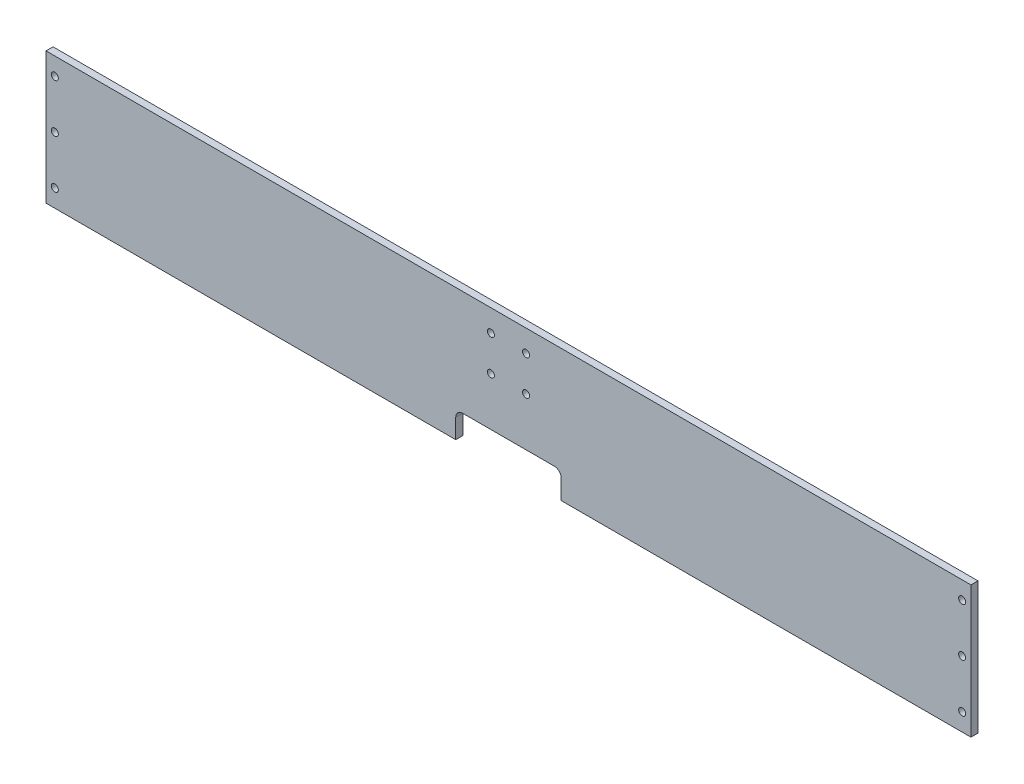
ISO-10303-21;
HEADER;
FILE_DESCRIPTION(('STEP AP214'),'2;1');
FILE_NAME('part.step','',(''),(''),'','','');
FILE_SCHEMA(('AUTOMOTIVE_DESIGN { 1 0 10303 214 1 1 1 1 }'));
ENDSEC;
DATA;
#1=APPLICATION_CONTEXT('core data for automotive mechanical design processes');
#2=APPLICATION_PROTOCOL_DEFINITION('international standard','automotive_design',2000,#1);
#3=PRODUCT_CONTEXT('',#1,'mechanical');
#4=PRODUCT('Part','Part','',(#3));
#5=PRODUCT_RELATED_PRODUCT_CATEGORY('part','',(#4));
#6=PRODUCT_DEFINITION_FORMATION('','',#4);
#7=PRODUCT_DEFINITION_CONTEXT('part definition',#1,'design');
#8=PRODUCT_DEFINITION('design','',#6,#7);
#9=PRODUCT_DEFINITION_SHAPE('','',#8);
#10=(LENGTH_UNIT() NAMED_UNIT(*) SI_UNIT(.MILLI.,.METRE.));
#11=(NAMED_UNIT(*) PLANE_ANGLE_UNIT() SI_UNIT($,.RADIAN.));
#12=(NAMED_UNIT(*) SI_UNIT($,.STERADIAN.) SOLID_ANGLE_UNIT());
#13=UNCERTAINTY_MEASURE_WITH_UNIT(LENGTH_MEASURE(1.E-05),#10,'distance_accuracy_value','');
#14=(GEOMETRIC_REPRESENTATION_CONTEXT(3) GLOBAL_UNCERTAINTY_ASSIGNED_CONTEXT((#13)) GLOBAL_UNIT_ASSIGNED_CONTEXT((#10,
#11,#12)) REPRESENTATION_CONTEXT('',''));
#15=CARTESIAN_POINT('',(0.,0.,0.));
#16=DIRECTION('',(0.,0.,1.));
#17=DIRECTION('',(1.,0.,0.));
#18=AXIS2_PLACEMENT_3D('',#15,#16,#17);
#19=CARTESIAN_POINT('',(0.,0.,-4.));
#20=DIRECTION('',(0.,-1.,0.));
#21=DIRECTION('',(0.,0.,-1.));
#22=AXIS2_PLACEMENT_3D('',#19,#20,#21);
#23=PLANE('',#22);
#24=DIRECTION('',(0.,0.,-1.));
#25=VECTOR('',#24,1.);
#26=CARTESIAN_POINT('',(233.,0.,-4.));
#27=LINE('',#26,#25);
#28=CARTESIAN_POINT('',(233.,0.,0.));
#29=VERTEX_POINT('',#28);
#30=CARTESIAN_POINT('',(233.,0.,-4.));
#31=VERTEX_POINT('',#30);
#32=EDGE_CURVE('E162',#29,#31,#27,.T.);
#33=ORIENTED_EDGE('',*,*,#32,.F.);
#34=DIRECTION('',(1.,0.,0.));
#35=VECTOR('',#34,1.);
#36=CARTESIAN_POINT('',(0.,0.,0.));
#37=LINE('',#36,#35);
#38=CARTESIAN_POINT('',(0.,0.,0.));
#39=VERTEX_POINT('',#38);
#40=EDGE_CURVE('E238',#39,#29,#37,.T.);
#41=ORIENTED_EDGE('',*,*,#40,.F.);
#42=DIRECTION('',(0.,0.,1.));
#43=VECTOR('',#42,1.);
#44=CARTESIAN_POINT('',(0.,0.,-4.));
#45=LINE('',#44,#43);
#46=CARTESIAN_POINT('',(0.,0.,-4.));
#47=VERTEX_POINT('',#46);
#48=EDGE_CURVE('E80',#47,#39,#45,.T.);
#49=ORIENTED_EDGE('',*,*,#48,.F.);
#50=DIRECTION('',(1.,0.,0.));
#51=VECTOR('',#50,1.);
#52=CARTESIAN_POINT('',(0.,0.,-4.));
#53=LINE('',#52,#51);
#54=EDGE_CURVE('E228',#47,#31,#53,.T.);
#55=ORIENTED_EDGE('',*,*,#54,.T.);
#56=EDGE_LOOP('',(#33,#41,#49,#55));
#57=FACE_BOUND('',#56,.T.);
#58=ADVANCED_FACE('F32',(#57),#23,.T.);
#59=CARTESIAN_POINT('',(0.,0.,-4.));
#60=DIRECTION('',(-1.,0.,0.));
#61=DIRECTION('',(0.,0.,1.));
#62=AXIS2_PLACEMENT_3D('',#59,#60,#61);
#63=PLANE('',#62);
#64=DIRECTION('',(0.,-1.,0.));
#65=VECTOR('',#64,1.);
#66=CARTESIAN_POINT('',(0.,0.,0.));
#67=LINE('',#66,#65);
#68=CARTESIAN_POINT('',(0.,75.,0.));
#69=VERTEX_POINT('',#68);
#70=EDGE_CURVE('E222',#69,#39,#67,.T.);
#71=ORIENTED_EDGE('',*,*,#70,.F.);
#72=DIRECTION('',(0.,0.,1.));
#73=VECTOR('',#72,1.);
#74=CARTESIAN_POINT('',(0.,75.,-4.));
#75=LINE('',#74,#73);
#76=CARTESIAN_POINT('',(0.,75.,-4.));
#77=VERTEX_POINT('',#76);
#78=EDGE_CURVE('E40',#77,#69,#75,.T.);
#79=ORIENTED_EDGE('',*,*,#78,.F.);
#80=DIRECTION('',(0.,-1.,0.));
#81=VECTOR('',#80,1.);
#82=CARTESIAN_POINT('',(0.,0.,-4.));
#83=LINE('',#82,#81);
#84=EDGE_CURVE('E225',#77,#47,#83,.T.);
#85=ORIENTED_EDGE('',*,*,#84,.T.);
#86=ORIENTED_EDGE('',*,*,#48,.T.);
#87=EDGE_LOOP('',(#71,#79,#85,#86));
#88=FACE_BOUND('',#87,.T.);
#89=ADVANCED_FACE('F34',(#88),#63,.T.);
#90=CARTESIAN_POINT('',(0.,75.,-4.));
#91=DIRECTION('',(0.,1.,0.));
#92=DIRECTION('',(0.,0.,1.));
#93=AXIS2_PLACEMENT_3D('',#90,#91,#92);
#94=PLANE('',#93);
#95=DIRECTION('',(-1.,0.,0.));
#96=VECTOR('',#95,1.);
#97=CARTESIAN_POINT('',(0.,75.,0.));
#98=LINE('',#97,#96);
#99=CARTESIAN_POINT('',(526.,75.,0.));
#100=VERTEX_POINT('',#99);
#101=EDGE_CURVE('E227',#100,#69,#98,.T.);
#102=ORIENTED_EDGE('',*,*,#101,.F.);
#103=DIRECTION('',(0.,0.,1.));
#104=VECTOR('',#103,1.);
#105=CARTESIAN_POINT('',(526.,75.,-4.));
#106=LINE('',#105,#104);
#107=CARTESIAN_POINT('',(526.,75.,-4.));
#108=VERTEX_POINT('',#107);
#109=EDGE_CURVE('E247',#108,#100,#106,.T.);
#110=ORIENTED_EDGE('',*,*,#109,.F.);
#111=DIRECTION('',(-1.,0.,0.));
#112=VECTOR('',#111,1.);
#113=CARTESIAN_POINT('',(0.,75.,-4.));
#114=LINE('',#113,#112);
#115=EDGE_CURVE('E233',#108,#77,#114,.T.);
#116=ORIENTED_EDGE('',*,*,#115,.T.);
#117=ORIENTED_EDGE('',*,*,#78,.T.);
#118=EDGE_LOOP('',(#102,#110,#116,#117));
#119=FACE_BOUND('',#118,.T.);
#120=ADVANCED_FACE('F256',(#119),#94,.T.);
#121=CARTESIAN_POINT('',(526.,0.,-4.));
#122=DIRECTION('',(1.,0.,0.));
#123=DIRECTION('',(0.,0.,-1.));
#124=AXIS2_PLACEMENT_3D('',#121,#122,#123);
#125=PLANE('',#124);
#126=DIRECTION('',(0.,1.,0.));
#127=VECTOR('',#126,1.);
#128=CARTESIAN_POINT('',(526.,0.,0.));
#129=LINE('',#128,#127);
#130=CARTESIAN_POINT('',(526.,0.,0.));
#131=VERTEX_POINT('',#130);
#132=EDGE_CURVE('E241',#131,#100,#129,.T.);
#133=ORIENTED_EDGE('',*,*,#132,.F.);
#134=DIRECTION('',(0.,0.,1.));
#135=VECTOR('',#134,1.);
#136=CARTESIAN_POINT('',(526.,0.,-4.));
#137=LINE('',#136,#135);
#138=CARTESIAN_POINT('',(526.,0.,-4.));
#139=VERTEX_POINT('',#138);
#140=EDGE_CURVE('E249',#139,#131,#137,.T.);
#141=ORIENTED_EDGE('',*,*,#140,.F.);
#142=DIRECTION('',(0.,1.,0.));
#143=VECTOR('',#142,1.);
#144=CARTESIAN_POINT('',(526.,0.,-4.));
#145=LINE('',#144,#143);
#146=EDGE_CURVE('E230',#139,#108,#145,.T.);
#147=ORIENTED_EDGE('',*,*,#146,.T.);
#148=ORIENTED_EDGE('',*,*,#109,.T.);
#149=EDGE_LOOP('',(#133,#141,#147,#148));
#150=FACE_BOUND('',#149,.T.);
#151=ADVANCED_FACE('F260',(#150),#125,.T.);
#152=DIRECTION('',(0.,0.,1.));
#153=VECTOR('',#152,1.);
#154=CARTESIAN_POINT('',(293.,0.,-4.));
#155=LINE('',#154,#153);
#156=CARTESIAN_POINT('',(293.,0.,-4.));
#157=VERTEX_POINT('',#156);
#158=CARTESIAN_POINT('',(293.,0.,0.));
#159=VERTEX_POINT('',#158);
#160=EDGE_CURVE('E47',#157,#159,#155,.T.);
#161=ORIENTED_EDGE('',*,*,#160,.F.);
#162=EDGE_CURVE('E138',#157,#139,#53,.T.);
#163=ORIENTED_EDGE('',*,*,#162,.T.);
#164=ORIENTED_EDGE('',*,*,#140,.T.);
#165=EDGE_CURVE('E237',#159,#131,#37,.T.);
#166=ORIENTED_EDGE('',*,*,#165,.F.);
#167=EDGE_LOOP('',(#161,#163,#164,#166));
#168=FACE_BOUND('',#167,.T.);
#169=ADVANCED_FACE('F273',(#168),#23,.T.);
#170=CARTESIAN_POINT('',(0.,0.,-4.));
#171=DIRECTION('',(0.,0.,-1.));
#172=DIRECTION('',(-1.,0.,0.));
#173=AXIS2_PLACEMENT_3D('',#170,#171,#172);
#174=PLANE('',#173);
#175=DIRECTION('',(0.,-1.,0.));
#176=VECTOR('',#175,1.);
#177=CARTESIAN_POINT('',(233.,-15.0000000000001,-4.));
#178=LINE('',#177,#176);
#179=CARTESIAN_POINT('',(233.,10.9999999999999,-4.));
#180=VERTEX_POINT('',#179);
#181=EDGE_CURVE('E123',#180,#31,#178,.T.);
#182=ORIENTED_EDGE('',*,*,#181,.T.);
#183=ORIENTED_EDGE('',*,*,#54,.F.);
#184=ORIENTED_EDGE('',*,*,#84,.F.);
#185=ORIENTED_EDGE('',*,*,#115,.F.);
#186=ORIENTED_EDGE('',*,*,#146,.F.);
#187=ORIENTED_EDGE('',*,*,#162,.F.);
#188=DIRECTION('',(0.,1.,0.));
#189=VECTOR('',#188,1.);
#190=CARTESIAN_POINT('',(293.,-15.0000000000001,-4.));
#191=LINE('',#190,#189);
#192=CARTESIAN_POINT('',(293.,10.9999999999999,-4.));
#193=VERTEX_POINT('',#192);
#194=EDGE_CURVE('E118',#157,#193,#191,.T.);
#195=ORIENTED_EDGE('',*,*,#194,.T.);
#196=CARTESIAN_POINT('',(289.,10.9999999999999,-4.));
#197=DIRECTION('',(0.,0.,1.));
#198=DIRECTION('',(1.,0.,0.));
#199=AXIS2_PLACEMENT_3D('',#196,#197,#198);
#200=CIRCLE('',#199,4.);
#201=CARTESIAN_POINT('',(289.,14.9999999999999,-4.));
#202=VERTEX_POINT('',#201);
#203=EDGE_CURVE('E126',#193,#202,#200,.T.);
#204=ORIENTED_EDGE('',*,*,#203,.T.);
#205=DIRECTION('',(-1.,0.,0.));
#206=VECTOR('',#205,1.);
#207=CARTESIAN_POINT('',(237.,14.9999999999999,-4.));
#208=LINE('',#207,#206);
#209=CARTESIAN_POINT('',(237.,14.9999999999999,-4.));
#210=VERTEX_POINT('',#209);
#211=EDGE_CURVE('E131',#202,#210,#208,.T.);
#212=ORIENTED_EDGE('',*,*,#211,.T.);
#213=CARTESIAN_POINT('',(237.,10.9999999999999,-4.));
#214=DIRECTION('',(0.,0.,1.));
#215=DIRECTION('',(1.,0.,0.));
#216=AXIS2_PLACEMENT_3D('',#213,#214,#215);
#217=CIRCLE('',#216,4.);
#218=EDGE_CURVE('E145',#210,#180,#217,.T.);
#219=ORIENTED_EDGE('',*,*,#218,.T.);
#220=EDGE_LOOP('',(#182,#183,#184,#185,#186,#187,#195,#204,#212,#219));
#221=FACE_BOUND('',#220,.T.);
#222=CARTESIAN_POINT('',(273.,42.5,-4.));
#223=DIRECTION('',(0.,0.,1.));
#224=DIRECTION('',(1.,0.,0.));
#225=AXIS2_PLACEMENT_3D('',#222,#223,#224);
#226=CIRCLE('',#225,2.);
#227=CARTESIAN_POINT('',(275.,42.5,-4.));
#228=VERTEX_POINT('',#227);
#229=EDGE_CURVE('E165',#228,#228,#226,.T.);
#230=ORIENTED_EDGE('',*,*,#229,.T.);
#231=EDGE_LOOP('',(#230));
#232=FACE_BOUND('',#231,.T.);
#233=CARTESIAN_POINT('',(253.,42.5,-4.));
#234=DIRECTION('',(0.,0.,1.));
#235=DIRECTION('',(1.,0.,0.));
#236=AXIS2_PLACEMENT_3D('',#233,#234,#235);
#237=CIRCLE('',#236,2.);
#238=CARTESIAN_POINT('',(255.,42.5,-4.));
#239=VERTEX_POINT('',#238);
#240=EDGE_CURVE('E171',#239,#239,#237,.T.);
#241=ORIENTED_EDGE('',*,*,#240,.T.);
#242=EDGE_LOOP('',(#241));
#243=FACE_BOUND('',#242,.T.);
#244=CARTESIAN_POINT('',(273.,62.5,-4.));
#245=DIRECTION('',(0.,0.,1.));
#246=DIRECTION('',(-1.,0.,0.));
#247=AXIS2_PLACEMENT_3D('',#244,#245,#246);
#248=CIRCLE('',#247,2.);
#249=CARTESIAN_POINT('',(271.,62.5,-4.));
#250=VERTEX_POINT('',#249);
#251=EDGE_CURVE('E177',#250,#250,#248,.T.);
#252=ORIENTED_EDGE('',*,*,#251,.T.);
#253=EDGE_LOOP('',(#252));
#254=FACE_BOUND('',#253,.T.);
#255=CARTESIAN_POINT('',(253.,62.5,-4.));
#256=DIRECTION('',(0.,0.,1.));
#257=DIRECTION('',(1.,0.,0.));
#258=AXIS2_PLACEMENT_3D('',#255,#256,#257);
#259=CIRCLE('',#258,2.);
#260=CARTESIAN_POINT('',(255.,62.5,-4.));
#261=VERTEX_POINT('',#260);
#262=EDGE_CURVE('E183',#261,#261,#259,.T.);
#263=ORIENTED_EDGE('',*,*,#262,.T.);
#264=EDGE_LOOP('',(#263));
#265=FACE_BOUND('',#264,.T.);
#266=CARTESIAN_POINT('',(521.,37.5,-4.));
#267=DIRECTION('',(0.,0.,1.));
#268=DIRECTION('',(-1.,0.,0.));
#269=AXIS2_PLACEMENT_3D('',#266,#267,#268);
#270=CIRCLE('',#269,2.);
#271=CARTESIAN_POINT('',(519.,37.5,-4.));
#272=VERTEX_POINT('',#271);
#273=EDGE_CURVE('E189',#272,#272,#270,.T.);
#274=ORIENTED_EDGE('',*,*,#273,.T.);
#275=EDGE_LOOP('',(#274));
#276=FACE_BOUND('',#275,.T.);
#277=CARTESIAN_POINT('',(521.,65.,-4.));
#278=DIRECTION('',(0.,0.,1.));
#279=DIRECTION('',(-1.,0.,0.));
#280=AXIS2_PLACEMENT_3D('',#277,#278,#279);
#281=CIRCLE('',#280,2.);
#282=CARTESIAN_POINT('',(519.,65.,-4.));
#283=VERTEX_POINT('',#282);
#284=EDGE_CURVE('E195',#283,#283,#281,.T.);
#285=ORIENTED_EDGE('',*,*,#284,.T.);
#286=EDGE_LOOP('',(#285));
#287=FACE_BOUND('',#286,.T.);
#288=CARTESIAN_POINT('',(521.,9.99999999999999,-4.));
#289=DIRECTION('',(0.,0.,1.));
#290=DIRECTION('',(1.,0.,0.));
#291=AXIS2_PLACEMENT_3D('',#288,#289,#290);
#292=CIRCLE('',#291,2.);
#293=CARTESIAN_POINT('',(523.,9.99999999999999,-4.));
#294=VERTEX_POINT('',#293);
#295=EDGE_CURVE('E201',#294,#294,#292,.T.);
#296=ORIENTED_EDGE('',*,*,#295,.T.);
#297=EDGE_LOOP('',(#296));
#298=FACE_BOUND('',#297,.T.);
#299=CARTESIAN_POINT('',(5.,9.99999999999999,-4.));
#300=DIRECTION('',(0.,0.,1.));
#301=DIRECTION('',(-1.,0.,0.));
#302=AXIS2_PLACEMENT_3D('',#299,#300,#301);
#303=CIRCLE('',#302,2.);
#304=CARTESIAN_POINT('',(3.,9.99999999999999,-4.));
#305=VERTEX_POINT('',#304);
#306=EDGE_CURVE('E207',#305,#305,#303,.T.);
#307=ORIENTED_EDGE('',*,*,#306,.T.);
#308=EDGE_LOOP('',(#307));
#309=FACE_BOUND('',#308,.T.);
#310=CARTESIAN_POINT('',(5.,65.,-4.));
#311=DIRECTION('',(0.,0.,1.));
#312=DIRECTION('',(1.,0.,0.));
#313=AXIS2_PLACEMENT_3D('',#310,#311,#312);
#314=CIRCLE('',#313,2.);
#315=CARTESIAN_POINT('',(7.,65.,-4.));
#316=VERTEX_POINT('',#315);
#317=EDGE_CURVE('E213',#316,#316,#314,.T.);
#318=ORIENTED_EDGE('',*,*,#317,.T.);
#319=EDGE_LOOP('',(#318));
#320=FACE_BOUND('',#319,.T.);
#321=CARTESIAN_POINT('',(5.,37.5,-4.));
#322=DIRECTION('',(0.,0.,1.));
#323=DIRECTION('',(1.,0.,0.));
#324=AXIS2_PLACEMENT_3D('',#321,#322,#323);
#325=CIRCLE('',#324,2.);
#326=CARTESIAN_POINT('',(7.00000000000001,37.5,-4.));
#327=VERTEX_POINT('',#326);
#328=EDGE_CURVE('E219',#327,#327,#325,.T.);
#329=ORIENTED_EDGE('',*,*,#328,.T.);
#330=EDGE_LOOP('',(#329));
#331=FACE_BOUND('',#330,.T.);
#332=ADVANCED_FACE('F135',(#221,#232,#243,#254,#265,#276,#287,#298,#309,#320,#331),#174,.T.);
#333=CARTESIAN_POINT('',(0.,0.,0.));
#334=DIRECTION('',(0.,0.,-1.));
#335=DIRECTION('',(-1.,0.,0.));
#336=AXIS2_PLACEMENT_3D('',#333,#334,#335);
#337=PLANE('',#336);
#338=CARTESIAN_POINT('',(273.,42.5,0.));
#339=DIRECTION('',(0.,0.,1.));
#340=DIRECTION('',(1.,0.,0.));
#341=AXIS2_PLACEMENT_3D('',#338,#339,#340);
#342=CIRCLE('',#341,2.);
#343=CARTESIAN_POINT('',(275.,42.5,0.));
#344=VERTEX_POINT('',#343);
#345=EDGE_CURVE('E164',#344,#344,#342,.T.);
#346=ORIENTED_EDGE('',*,*,#345,.F.);
#347=EDGE_LOOP('',(#346));
#348=FACE_BOUND('',#347,.T.);
#349=CARTESIAN_POINT('',(253.,42.5,0.));
#350=DIRECTION('',(0.,0.,1.));
#351=DIRECTION('',(1.,0.,0.));
#352=AXIS2_PLACEMENT_3D('',#349,#350,#351);
#353=CIRCLE('',#352,2.);
#354=CARTESIAN_POINT('',(255.,42.5,0.));
#355=VERTEX_POINT('',#354);
#356=EDGE_CURVE('E168',#355,#355,#353,.T.);
#357=ORIENTED_EDGE('',*,*,#356,.F.);
#358=EDGE_LOOP('',(#357));
#359=FACE_BOUND('',#358,.T.);
#360=CARTESIAN_POINT('',(273.,62.5,0.));
#361=DIRECTION('',(0.,0.,1.));
#362=DIRECTION('',(-1.,0.,0.));
#363=AXIS2_PLACEMENT_3D('',#360,#361,#362);
#364=CIRCLE('',#363,2.);
#365=CARTESIAN_POINT('',(271.,62.5,0.));
#366=VERTEX_POINT('',#365);
#367=EDGE_CURVE('E174',#366,#366,#364,.T.);
#368=ORIENTED_EDGE('',*,*,#367,.F.);
#369=EDGE_LOOP('',(#368));
#370=FACE_BOUND('',#369,.T.);
#371=CARTESIAN_POINT('',(253.,62.5,0.));
#372=DIRECTION('',(0.,0.,1.));
#373=DIRECTION('',(1.,0.,0.));
#374=AXIS2_PLACEMENT_3D('',#371,#372,#373);
#375=CIRCLE('',#374,2.);
#376=CARTESIAN_POINT('',(255.,62.5,0.));
#377=VERTEX_POINT('',#376);
#378=EDGE_CURVE('E180',#377,#377,#375,.T.);
#379=ORIENTED_EDGE('',*,*,#378,.F.);
#380=EDGE_LOOP('',(#379));
#381=FACE_BOUND('',#380,.T.);
#382=CARTESIAN_POINT('',(521.,37.5,0.));
#383=DIRECTION('',(0.,0.,1.));
#384=DIRECTION('',(-1.,0.,0.));
#385=AXIS2_PLACEMENT_3D('',#382,#383,#384);
#386=CIRCLE('',#385,2.);
#387=CARTESIAN_POINT('',(519.,37.5,0.));
#388=VERTEX_POINT('',#387);
#389=EDGE_CURVE('E186',#388,#388,#386,.T.);
#390=ORIENTED_EDGE('',*,*,#389,.F.);
#391=EDGE_LOOP('',(#390));
#392=FACE_BOUND('',#391,.T.);
#393=CARTESIAN_POINT('',(521.,65.,0.));
#394=DIRECTION('',(0.,0.,1.));
#395=DIRECTION('',(-1.,0.,0.));
#396=AXIS2_PLACEMENT_3D('',#393,#394,#395);
#397=CIRCLE('',#396,2.);
#398=CARTESIAN_POINT('',(519.,65.,0.));
#399=VERTEX_POINT('',#398);
#400=EDGE_CURVE('E192',#399,#399,#397,.T.);
#401=ORIENTED_EDGE('',*,*,#400,.F.);
#402=EDGE_LOOP('',(#401));
#403=FACE_BOUND('',#402,.T.);
#404=CARTESIAN_POINT('',(521.,9.99999999999999,0.));
#405=DIRECTION('',(0.,0.,1.));
#406=DIRECTION('',(1.,0.,0.));
#407=AXIS2_PLACEMENT_3D('',#404,#405,#406);
#408=CIRCLE('',#407,2.);
#409=CARTESIAN_POINT('',(523.,9.99999999999999,0.));
#410=VERTEX_POINT('',#409);
#411=EDGE_CURVE('E198',#410,#410,#408,.T.);
#412=ORIENTED_EDGE('',*,*,#411,.F.);
#413=EDGE_LOOP('',(#412));
#414=FACE_BOUND('',#413,.T.);
#415=CARTESIAN_POINT('',(5.,9.99999999999999,0.));
#416=DIRECTION('',(0.,0.,1.));
#417=DIRECTION('',(-1.,0.,0.));
#418=AXIS2_PLACEMENT_3D('',#415,#416,#417);
#419=CIRCLE('',#418,2.);
#420=CARTESIAN_POINT('',(3.,9.99999999999999,0.));
#421=VERTEX_POINT('',#420);
#422=EDGE_CURVE('E204',#421,#421,#419,.T.);
#423=ORIENTED_EDGE('',*,*,#422,.F.);
#424=EDGE_LOOP('',(#423));
#425=FACE_BOUND('',#424,.T.);
#426=CARTESIAN_POINT('',(5.,65.,0.));
#427=DIRECTION('',(0.,0.,1.));
#428=DIRECTION('',(1.,0.,0.));
#429=AXIS2_PLACEMENT_3D('',#426,#427,#428);
#430=CIRCLE('',#429,2.);
#431=CARTESIAN_POINT('',(7.,65.,0.));
#432=VERTEX_POINT('',#431);
#433=EDGE_CURVE('E210',#432,#432,#430,.T.);
#434=ORIENTED_EDGE('',*,*,#433,.F.);
#435=EDGE_LOOP('',(#434));
#436=FACE_BOUND('',#435,.T.);
#437=CARTESIAN_POINT('',(5.,37.5,0.));
#438=DIRECTION('',(0.,0.,1.));
#439=DIRECTION('',(1.,0.,0.));
#440=AXIS2_PLACEMENT_3D('',#437,#438,#439);
#441=CIRCLE('',#440,2.);
#442=CARTESIAN_POINT('',(7.00000000000001,37.5,0.));
#443=VERTEX_POINT('',#442);
#444=EDGE_CURVE('E216',#443,#443,#441,.T.);
#445=ORIENTED_EDGE('',*,*,#444,.F.);
#446=EDGE_LOOP('',(#445));
#447=FACE_BOUND('',#446,.T.);
#448=ORIENTED_EDGE('',*,*,#40,.T.);
#449=DIRECTION('',(0.,-1.,0.));
#450=VECTOR('',#449,1.);
#451=CARTESIAN_POINT('',(233.,-15.0000000000001,0.));
#452=LINE('',#451,#450);
#453=CARTESIAN_POINT('',(233.,10.9999999999999,0.));
#454=VERTEX_POINT('',#453);
#455=EDGE_CURVE('E139',#454,#29,#452,.T.);
#456=ORIENTED_EDGE('',*,*,#455,.F.);
#457=CARTESIAN_POINT('',(237.,10.9999999999999,0.));
#458=DIRECTION('',(0.,0.,1.));
#459=DIRECTION('',(1.,0.,0.));
#460=AXIS2_PLACEMENT_3D('',#457,#458,#459);
#461=CIRCLE('',#460,4.);
#462=CARTESIAN_POINT('',(237.,14.9999999999999,0.));
#463=VERTEX_POINT('',#462);
#464=EDGE_CURVE('E141',#463,#454,#461,.T.);
#465=ORIENTED_EDGE('',*,*,#464,.F.);
#466=DIRECTION('',(-1.,0.,0.));
#467=VECTOR('',#466,1.);
#468=CARTESIAN_POINT('',(237.,14.9999999999999,0.));
#469=LINE('',#468,#467);
#470=CARTESIAN_POINT('',(289.,14.9999999999999,0.));
#471=VERTEX_POINT('',#470);
#472=EDGE_CURVE('E151',#471,#463,#469,.T.);
#473=ORIENTED_EDGE('',*,*,#472,.F.);
#474=CARTESIAN_POINT('',(289.,10.9999999999999,0.));
#475=DIRECTION('',(0.,0.,1.));
#476=DIRECTION('',(1.,0.,0.));
#477=AXIS2_PLACEMENT_3D('',#474,#475,#476);
#478=CIRCLE('',#477,4.);
#479=CARTESIAN_POINT('',(293.,10.9999999999999,0.));
#480=VERTEX_POINT('',#479);
#481=EDGE_CURVE('E149',#480,#471,#478,.T.);
#482=ORIENTED_EDGE('',*,*,#481,.F.);
#483=DIRECTION('',(0.,-1.,0.));
#484=VECTOR('',#483,1.);
#485=CARTESIAN_POINT('',(293.,0.,0.));
#486=LINE('',#485,#484);
#487=EDGE_CURVE('E11',#480,#159,#486,.T.);
#488=ORIENTED_EDGE('',*,*,#487,.T.);
#489=ORIENTED_EDGE('',*,*,#165,.T.);
#490=ORIENTED_EDGE('',*,*,#132,.T.);
#491=ORIENTED_EDGE('',*,*,#101,.T.);
#492=ORIENTED_EDGE('',*,*,#70,.T.);
#493=EDGE_LOOP('',(#448,#456,#465,#473,#482,#488,#489,#490,#491,#492));
#494=FACE_BOUND('',#493,.T.);
#495=ADVANCED_FACE('F254',(#348,#359,#370,#381,#392,#403,#414,#425,#436,#447,#494),#337,.F.);
#496=CARTESIAN_POINT('',(5.,37.5,-4.));
#497=DIRECTION('',(0.,0.,1.));
#498=DIRECTION('',(1.,0.,0.));
#499=AXIS2_PLACEMENT_3D('',#496,#497,#498);
#500=CYLINDRICAL_SURFACE('',#499,2.);
#501=ORIENTED_EDGE('',*,*,#328,.F.);
#502=EDGE_LOOP('',(#501));
#503=FACE_BOUND('',#502,.T.);
#504=ORIENTED_EDGE('',*,*,#444,.T.);
#505=EDGE_LOOP('',(#504));
#506=FACE_BOUND('',#505,.T.);
#507=ADVANCED_FACE('F293',(#503,#506),#500,.F.);
#508=CARTESIAN_POINT('',(5.,65.,-4.));
#509=DIRECTION('',(0.,0.,1.));
#510=DIRECTION('',(1.,0.,0.));
#511=AXIS2_PLACEMENT_3D('',#508,#509,#510);
#512=CYLINDRICAL_SURFACE('',#511,2.);
#513=ORIENTED_EDGE('',*,*,#317,.F.);
#514=EDGE_LOOP('',(#513));
#515=FACE_BOUND('',#514,.T.);
#516=ORIENTED_EDGE('',*,*,#433,.T.);
#517=EDGE_LOOP('',(#516));
#518=FACE_BOUND('',#517,.T.);
#519=ADVANCED_FACE('F298',(#515,#518),#512,.F.);
#520=CARTESIAN_POINT('',(5.,9.99999999999999,-4.));
#521=DIRECTION('',(0.,0.,1.));
#522=DIRECTION('',(1.,0.,0.));
#523=AXIS2_PLACEMENT_3D('',#520,#521,#522);
#524=CYLINDRICAL_SURFACE('',#523,2.);
#525=ORIENTED_EDGE('',*,*,#306,.F.);
#526=EDGE_LOOP('',(#525));
#527=FACE_BOUND('',#526,.T.);
#528=ORIENTED_EDGE('',*,*,#422,.T.);
#529=EDGE_LOOP('',(#528));
#530=FACE_BOUND('',#529,.T.);
#531=ADVANCED_FACE('F302',(#527,#530),#524,.F.);
#532=CARTESIAN_POINT('',(521.,9.99999999999999,-4.));
#533=DIRECTION('',(0.,0.,1.));
#534=DIRECTION('',(1.,0.,0.));
#535=AXIS2_PLACEMENT_3D('',#532,#533,#534);
#536=CYLINDRICAL_SURFACE('',#535,2.);
#537=ORIENTED_EDGE('',*,*,#295,.F.);
#538=EDGE_LOOP('',(#537));
#539=FACE_BOUND('',#538,.T.);
#540=ORIENTED_EDGE('',*,*,#411,.T.);
#541=EDGE_LOOP('',(#540));
#542=FACE_BOUND('',#541,.T.);
#543=ADVANCED_FACE('F306',(#539,#542),#536,.F.);
#544=CARTESIAN_POINT('',(521.,65.,-4.));
#545=DIRECTION('',(0.,0.,1.));
#546=DIRECTION('',(1.,0.,0.));
#547=AXIS2_PLACEMENT_3D('',#544,#545,#546);
#548=CYLINDRICAL_SURFACE('',#547,2.);
#549=ORIENTED_EDGE('',*,*,#284,.F.);
#550=EDGE_LOOP('',(#549));
#551=FACE_BOUND('',#550,.T.);
#552=ORIENTED_EDGE('',*,*,#400,.T.);
#553=EDGE_LOOP('',(#552));
#554=FACE_BOUND('',#553,.T.);
#555=ADVANCED_FACE('F310',(#551,#554),#548,.F.);
#556=CARTESIAN_POINT('',(521.,37.5,-4.));
#557=DIRECTION('',(0.,0.,1.));
#558=DIRECTION('',(1.,0.,0.));
#559=AXIS2_PLACEMENT_3D('',#556,#557,#558);
#560=CYLINDRICAL_SURFACE('',#559,2.);
#561=ORIENTED_EDGE('',*,*,#273,.F.);
#562=EDGE_LOOP('',(#561));
#563=FACE_BOUND('',#562,.T.);
#564=ORIENTED_EDGE('',*,*,#389,.T.);
#565=EDGE_LOOP('',(#564));
#566=FACE_BOUND('',#565,.T.);
#567=ADVANCED_FACE('F314',(#563,#566),#560,.F.);
#568=CARTESIAN_POINT('',(253.,62.5,-4.));
#569=DIRECTION('',(0.,0.,1.));
#570=DIRECTION('',(1.,0.,0.));
#571=AXIS2_PLACEMENT_3D('',#568,#569,#570);
#572=CYLINDRICAL_SURFACE('',#571,2.);
#573=ORIENTED_EDGE('',*,*,#262,.F.);
#574=EDGE_LOOP('',(#573));
#575=FACE_BOUND('',#574,.T.);
#576=ORIENTED_EDGE('',*,*,#378,.T.);
#577=EDGE_LOOP('',(#576));
#578=FACE_BOUND('',#577,.T.);
#579=ADVANCED_FACE('F318',(#575,#578),#572,.F.);
#580=CARTESIAN_POINT('',(273.,62.5,-4.));
#581=DIRECTION('',(0.,0.,1.));
#582=DIRECTION('',(1.,0.,0.));
#583=AXIS2_PLACEMENT_3D('',#580,#581,#582);
#584=CYLINDRICAL_SURFACE('',#583,2.);
#585=ORIENTED_EDGE('',*,*,#251,.F.);
#586=EDGE_LOOP('',(#585));
#587=FACE_BOUND('',#586,.T.);
#588=ORIENTED_EDGE('',*,*,#367,.T.);
#589=EDGE_LOOP('',(#588));
#590=FACE_BOUND('',#589,.T.);
#591=ADVANCED_FACE('F322',(#587,#590),#584,.F.);
#592=CARTESIAN_POINT('',(253.,42.5,-4.));
#593=DIRECTION('',(0.,0.,1.));
#594=DIRECTION('',(1.,0.,0.));
#595=AXIS2_PLACEMENT_3D('',#592,#593,#594);
#596=CYLINDRICAL_SURFACE('',#595,2.);
#597=ORIENTED_EDGE('',*,*,#240,.F.);
#598=EDGE_LOOP('',(#597));
#599=FACE_BOUND('',#598,.T.);
#600=ORIENTED_EDGE('',*,*,#356,.T.);
#601=EDGE_LOOP('',(#600));
#602=FACE_BOUND('',#601,.T.);
#603=ADVANCED_FACE('F326',(#599,#602),#596,.F.);
#604=CARTESIAN_POINT('',(273.,42.5,-4.));
#605=DIRECTION('',(0.,0.,1.));
#606=DIRECTION('',(1.,0.,0.));
#607=AXIS2_PLACEMENT_3D('',#604,#605,#606);
#608=CYLINDRICAL_SURFACE('',#607,2.);
#609=ORIENTED_EDGE('',*,*,#229,.F.);
#610=EDGE_LOOP('',(#609));
#611=FACE_BOUND('',#610,.T.);
#612=ORIENTED_EDGE('',*,*,#345,.T.);
#613=EDGE_LOOP('',(#612));
#614=FACE_BOUND('',#613,.T.);
#615=ADVANCED_FACE('F330',(#611,#614),#608,.F.);
#616=CARTESIAN_POINT('',(233.,-15.0000000000001,-4.));
#617=DIRECTION('',(-1.,0.,0.));
#618=DIRECTION('',(0.,0.,1.));
#619=AXIS2_PLACEMENT_3D('',#616,#617,#618);
#620=PLANE('',#619);
#621=ORIENTED_EDGE('',*,*,#32,.T.);
#622=ORIENTED_EDGE('',*,*,#181,.F.);
#623=DIRECTION('',(0.,0.,1.));
#624=VECTOR('',#623,1.);
#625=CARTESIAN_POINT('',(233.,10.9999999999999,-4.));
#626=LINE('',#625,#624);
#627=EDGE_CURVE('E156',#180,#454,#626,.T.);
#628=ORIENTED_EDGE('',*,*,#627,.T.);
#629=ORIENTED_EDGE('',*,*,#455,.T.);
#630=EDGE_LOOP('',(#621,#622,#628,#629));
#631=FACE_BOUND('',#630,.T.);
#632=ADVANCED_FACE('F264',(#631),#620,.F.);
#633=CARTESIAN_POINT('',(237.,10.9999999999999,-4.));
#634=DIRECTION('',(0.,0.,1.));
#635=DIRECTION('',(1.,0.,0.));
#636=AXIS2_PLACEMENT_3D('',#633,#634,#635);
#637=CYLINDRICAL_SURFACE('',#636,4.);
#638=ORIENTED_EDGE('',*,*,#464,.T.);
#639=ORIENTED_EDGE('',*,*,#627,.F.);
#640=ORIENTED_EDGE('',*,*,#218,.F.);
#641=DIRECTION('',(0.,0.,1.));
#642=VECTOR('',#641,1.);
#643=CARTESIAN_POINT('',(237.,14.9999999999999,-4.));
#644=LINE('',#643,#642);
#645=EDGE_CURVE('E158',#210,#463,#644,.T.);
#646=ORIENTED_EDGE('',*,*,#645,.T.);
#647=EDGE_LOOP('',(#638,#639,#640,#646));
#648=FACE_BOUND('',#647,.T.);
#649=ADVANCED_FACE('F268',(#648),#637,.F.);
#650=CARTESIAN_POINT('',(237.,14.9999999999999,-4.));
#651=DIRECTION('',(0.,1.,0.));
#652=DIRECTION('',(0.,0.,1.));
#653=AXIS2_PLACEMENT_3D('',#650,#651,#652);
#654=PLANE('',#653);
#655=ORIENTED_EDGE('',*,*,#472,.T.);
#656=ORIENTED_EDGE('',*,*,#645,.F.);
#657=ORIENTED_EDGE('',*,*,#211,.F.);
#658=DIRECTION('',(0.,0.,1.));
#659=VECTOR('',#658,1.);
#660=CARTESIAN_POINT('',(289.,14.9999999999999,-4.));
#661=LINE('',#660,#659);
#662=EDGE_CURVE('E122',#202,#471,#661,.T.);
#663=ORIENTED_EDGE('',*,*,#662,.T.);
#664=EDGE_LOOP('',(#655,#656,#657,#663));
#665=FACE_BOUND('',#664,.T.);
#666=ADVANCED_FACE('F270',(#665),#654,.F.);
#667=CARTESIAN_POINT('',(289.,10.9999999999999,-4.));
#668=DIRECTION('',(0.,0.,1.));
#669=DIRECTION('',(1.,0.,0.));
#670=AXIS2_PLACEMENT_3D('',#667,#668,#669);
#671=CYLINDRICAL_SURFACE('',#670,4.);
#672=ORIENTED_EDGE('',*,*,#481,.T.);
#673=ORIENTED_EDGE('',*,*,#662,.F.);
#674=ORIENTED_EDGE('',*,*,#203,.F.);
#675=DIRECTION('',(0.,0.,1.));
#676=VECTOR('',#675,1.);
#677=CARTESIAN_POINT('',(293.,10.9999999999999,-4.));
#678=LINE('',#677,#676);
#679=EDGE_CURVE('E114',#193,#480,#678,.T.);
#680=ORIENTED_EDGE('',*,*,#679,.T.);
#681=EDGE_LOOP('',(#672,#673,#674,#680));
#682=FACE_BOUND('',#681,.T.);
#683=ADVANCED_FACE('F127',(#682),#671,.F.);
#684=CARTESIAN_POINT('',(293.,-15.0000000000001,-4.));
#685=DIRECTION('',(1.,0.,0.));
#686=DIRECTION('',(0.,0.,-1.));
#687=AXIS2_PLACEMENT_3D('',#684,#685,#686);
#688=PLANE('',#687);
#689=ORIENTED_EDGE('',*,*,#160,.T.);
#690=ORIENTED_EDGE('',*,*,#487,.F.);
#691=ORIENTED_EDGE('',*,*,#679,.F.);
#692=ORIENTED_EDGE('',*,*,#194,.F.);
#693=EDGE_LOOP('',(#689,#690,#691,#692));
#694=FACE_BOUND('',#693,.T.);
#695=ADVANCED_FACE('F116',(#694),#688,.F.);
#696=CLOSED_SHELL('',(#58,#89,#120,#151,#169,#332,#495,#507,#519,#531,#543,#555,#567,#579,#591,
#603,#615,#632,#649,#666,#683,#695));
#697=MANIFOLD_SOLID_BREP('B2',#696);
#698=ADVANCED_BREP_SHAPE_REPRESENTATION('',(#18,#697),#14);
#699=SHAPE_DEFINITION_REPRESENTATION(#9,#698);
ENDSEC;
END-ISO-10303-21;
